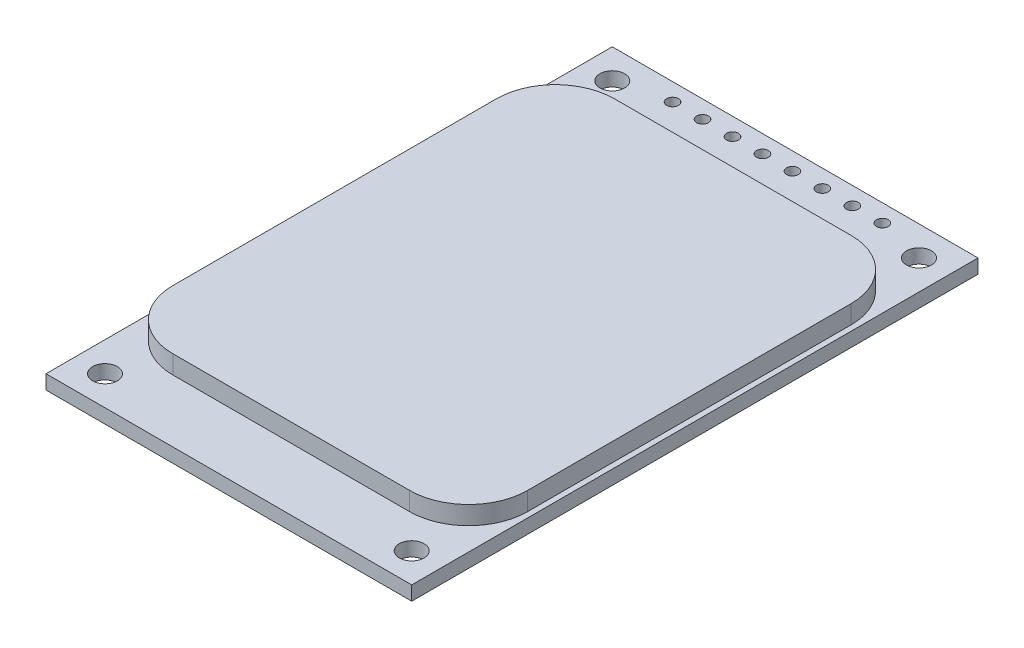
ISO-10303-21;
HEADER;
FILE_DESCRIPTION(('STEP AP214'),'2;1');
FILE_NAME('part.step','',(''),(''),'','','');
FILE_SCHEMA(('AUTOMOTIVE_DESIGN { 1 0 10303 214 1 1 1 1 }'));
ENDSEC;
DATA;
#1=APPLICATION_CONTEXT('core data for automotive mechanical design processes');
#2=APPLICATION_PROTOCOL_DEFINITION('international standard','automotive_design',2000,#1);
#3=PRODUCT_CONTEXT('',#1,'mechanical');
#4=PRODUCT('Part','Part','',(#3));
#5=PRODUCT_RELATED_PRODUCT_CATEGORY('part','',(#4));
#6=PRODUCT_DEFINITION_FORMATION('','',#4);
#7=PRODUCT_DEFINITION_CONTEXT('part definition',#1,'design');
#8=PRODUCT_DEFINITION('design','',#6,#7);
#9=PRODUCT_DEFINITION_SHAPE('','',#8);
#10=(LENGTH_UNIT() NAMED_UNIT(*) SI_UNIT(.MILLI.,.METRE.));
#11=(NAMED_UNIT(*) PLANE_ANGLE_UNIT() SI_UNIT($,.RADIAN.));
#12=(NAMED_UNIT(*) SI_UNIT($,.STERADIAN.) SOLID_ANGLE_UNIT());
#13=UNCERTAINTY_MEASURE_WITH_UNIT(LENGTH_MEASURE(1.E-05),#10,'distance_accuracy_value','');
#14=(GEOMETRIC_REPRESENTATION_CONTEXT(3) GLOBAL_UNCERTAINTY_ASSIGNED_CONTEXT((#13)) GLOBAL_UNIT_ASSIGNED_CONTEXT((#10,
#11,#12)) REPRESENTATION_CONTEXT('',''));
#15=CARTESIAN_POINT('',(0.,0.,0.));
#16=DIRECTION('',(0.,0.,1.));
#17=DIRECTION('',(1.,0.,0.));
#18=AXIS2_PLACEMENT_3D('',#15,#16,#17);
#19=CARTESIAN_POINT('',(0.,1.2,0.));
#20=DIRECTION('',(1.,0.,0.));
#21=DIRECTION('',(0.,0.,-1.));
#22=AXIS2_PLACEMENT_3D('',#19,#20,#21);
#23=PLANE('',#22);
#24=DIRECTION('',(0.,0.,1.));
#25=VECTOR('',#24,1.);
#26=CARTESIAN_POINT('',(0.,0.,0.));
#27=LINE('',#26,#25);
#28=CARTESIAN_POINT('',(0.,0.,0.));
#29=VERTEX_POINT('',#28);
#30=CARTESIAN_POINT('',(0.,0.,48.));
#31=VERTEX_POINT('',#30);
#32=EDGE_CURVE('E150',#29,#31,#27,.T.);
#33=ORIENTED_EDGE('',*,*,#32,.T.);
#34=DIRECTION('',(0.,-1.,0.));
#35=VECTOR('',#34,1.);
#36=CARTESIAN_POINT('',(0.,1.2,48.));
#37=LINE('',#36,#35);
#38=CARTESIAN_POINT('',(0.,1.2,48.));
#39=VERTEX_POINT('',#38);
#40=EDGE_CURVE('E131',#39,#31,#37,.T.);
#41=ORIENTED_EDGE('',*,*,#40,.F.);
#42=DIRECTION('',(0.,0.,1.));
#43=VECTOR('',#42,1.);
#44=CARTESIAN_POINT('',(0.,1.2,0.));
#45=LINE('',#44,#43);
#46=CARTESIAN_POINT('',(0.,1.2,0.));
#47=VERTEX_POINT('',#46);
#48=EDGE_CURVE('E138',#47,#39,#45,.T.);
#49=ORIENTED_EDGE('',*,*,#48,.F.);
#50=DIRECTION('',(0.,-1.,0.));
#51=VECTOR('',#50,1.);
#52=CARTESIAN_POINT('',(0.,1.2,0.));
#53=LINE('',#52,#51);
#54=EDGE_CURVE('E297',#47,#29,#53,.T.);
#55=ORIENTED_EDGE('',*,*,#54,.T.);
#56=EDGE_LOOP('',(#33,#41,#49,#55));
#57=FACE_BOUND('',#56,.T.);
#58=ADVANCED_FACE('F39',(#57),#23,.F.);
#59=CARTESIAN_POINT('',(0.,1.2,48.));
#60=DIRECTION('',(0.,0.,-1.));
#61=DIRECTION('',(-1.,0.,0.));
#62=AXIS2_PLACEMENT_3D('',#59,#60,#61);
#63=PLANE('',#62);
#64=DIRECTION('',(1.,0.,0.));
#65=VECTOR('',#64,1.);
#66=CARTESIAN_POINT('',(0.,0.,48.));
#67=LINE('',#66,#65);
#68=CARTESIAN_POINT('',(31.,0.,48.));
#69=VERTEX_POINT('',#68);
#70=EDGE_CURVE('E299',#31,#69,#67,.T.);
#71=ORIENTED_EDGE('',*,*,#70,.T.);
#72=DIRECTION('',(0.,-1.,0.));
#73=VECTOR('',#72,1.);
#74=CARTESIAN_POINT('',(31.,1.2,48.));
#75=LINE('',#74,#73);
#76=CARTESIAN_POINT('',(31.,1.2,48.));
#77=VERTEX_POINT('',#76);
#78=EDGE_CURVE('E134',#77,#69,#75,.T.);
#79=ORIENTED_EDGE('',*,*,#78,.F.);
#80=DIRECTION('',(1.,0.,0.));
#81=VECTOR('',#80,1.);
#82=CARTESIAN_POINT('',(0.,1.2,48.));
#83=LINE('',#82,#81);
#84=EDGE_CURVE('E127',#39,#77,#83,.T.);
#85=ORIENTED_EDGE('',*,*,#84,.F.);
#86=ORIENTED_EDGE('',*,*,#40,.T.);
#87=EDGE_LOOP('',(#71,#79,#85,#86));
#88=FACE_BOUND('',#87,.T.);
#89=ADVANCED_FACE('F129',(#88),#63,.F.);
#90=CARTESIAN_POINT('',(31.,1.2,0.));
#91=DIRECTION('',(-1.,0.,0.));
#92=DIRECTION('',(0.,0.,1.));
#93=AXIS2_PLACEMENT_3D('',#90,#91,#92);
#94=PLANE('',#93);
#95=DIRECTION('',(0.,0.,-1.));
#96=VECTOR('',#95,1.);
#97=CARTESIAN_POINT('',(31.,0.,0.));
#98=LINE('',#97,#96);
#99=CARTESIAN_POINT('',(31.,0.,0.));
#100=VERTEX_POINT('',#99);
#101=EDGE_CURVE('E301',#69,#100,#98,.T.);
#102=ORIENTED_EDGE('',*,*,#101,.T.);
#103=DIRECTION('',(0.,-1.,0.));
#104=VECTOR('',#103,1.);
#105=CARTESIAN_POINT('',(31.,1.2,0.));
#106=LINE('',#105,#104);
#107=CARTESIAN_POINT('',(31.,1.2,0.));
#108=VERTEX_POINT('',#107);
#109=EDGE_CURVE('E155',#108,#100,#106,.T.);
#110=ORIENTED_EDGE('',*,*,#109,.F.);
#111=DIRECTION('',(0.,0.,-1.));
#112=VECTOR('',#111,1.);
#113=CARTESIAN_POINT('',(31.,1.2,0.));
#114=LINE('',#113,#112);
#115=EDGE_CURVE('E137',#77,#108,#114,.T.);
#116=ORIENTED_EDGE('',*,*,#115,.F.);
#117=ORIENTED_EDGE('',*,*,#78,.T.);
#118=EDGE_LOOP('',(#102,#110,#116,#117));
#119=FACE_BOUND('',#118,.T.);
#120=ADVANCED_FACE('F313',(#119),#94,.F.);
#121=CARTESIAN_POINT('',(0.,1.2,0.));
#122=DIRECTION('',(0.,0.,1.));
#123=DIRECTION('',(1.,0.,0.));
#124=AXIS2_PLACEMENT_3D('',#121,#122,#123);
#125=PLANE('',#124);
#126=DIRECTION('',(-1.,0.,0.));
#127=VECTOR('',#126,1.);
#128=CARTESIAN_POINT('',(0.,0.,0.));
#129=LINE('',#128,#127);
#130=EDGE_CURVE('E147',#100,#29,#129,.T.);
#131=ORIENTED_EDGE('',*,*,#130,.T.);
#132=ORIENTED_EDGE('',*,*,#54,.F.);
#133=DIRECTION('',(-1.,0.,0.));
#134=VECTOR('',#133,1.);
#135=CARTESIAN_POINT('',(0.,1.2,0.));
#136=LINE('',#135,#134);
#137=EDGE_CURVE('E143',#108,#47,#136,.T.);
#138=ORIENTED_EDGE('',*,*,#137,.F.);
#139=ORIENTED_EDGE('',*,*,#109,.T.);
#140=EDGE_LOOP('',(#131,#132,#138,#139));
#141=FACE_BOUND('',#140,.T.);
#142=ADVANCED_FACE('F308',(#141),#125,.F.);
#143=CARTESIAN_POINT('',(0.,1.2,0.));
#144=DIRECTION('',(0.,1.,0.));
#145=DIRECTION('',(0.,0.,1.));
#146=AXIS2_PLACEMENT_3D('',#143,#144,#145);
#147=PLANE('',#146);
#148=DIRECTION('',(0.,0.,1.));
#149=VECTOR('',#148,1.);
#150=CARTESIAN_POINT('',(0.465000000000001,1.2,5.285));
#151=LINE('',#150,#149);
#152=CARTESIAN_POINT('',(0.465000000000001,1.2,10.285));
#153=VERTEX_POINT('',#152);
#154=CARTESIAN_POINT('',(0.465000000000003,1.2,37.715));
#155=VERTEX_POINT('',#154);
#156=EDGE_CURVE('E220',#153,#155,#151,.T.);
#157=ORIENTED_EDGE('',*,*,#156,.F.);
#158=CARTESIAN_POINT('',(5.465,1.2,10.285));
#159=DIRECTION('',(0.,1.,0.));
#160=DIRECTION('',(0.,0.,1.));
#161=AXIS2_PLACEMENT_3D('',#158,#159,#160);
#162=CIRCLE('',#161,5.);
#163=CARTESIAN_POINT('',(5.465,1.2,5.285));
#164=VERTEX_POINT('',#163);
#165=EDGE_CURVE('E11',#153,#164,#162,.F.);
#166=ORIENTED_EDGE('',*,*,#165,.T.);
#167=DIRECTION('',(-1.,0.,0.));
#168=VECTOR('',#167,1.);
#169=CARTESIAN_POINT('',(0.465000000000001,1.2,5.285));
#170=LINE('',#169,#168);
#171=CARTESIAN_POINT('',(25.535,1.2,5.285));
#172=VERTEX_POINT('',#171);
#173=EDGE_CURVE('E190',#172,#164,#170,.T.);
#174=ORIENTED_EDGE('',*,*,#173,.F.);
#175=CARTESIAN_POINT('',(25.535,1.2,10.285));
#176=DIRECTION('',(0.,1.,0.));
#177=DIRECTION('',(0.,0.,1.));
#178=AXIS2_PLACEMENT_3D('',#175,#176,#177);
#179=CIRCLE('',#178,5.);
#180=CARTESIAN_POINT('',(30.535,1.2,10.285));
#181=VERTEX_POINT('',#180);
#182=EDGE_CURVE('E47',#172,#181,#179,.F.);
#183=ORIENTED_EDGE('',*,*,#182,.T.);
#184=DIRECTION('',(0.,0.,-1.));
#185=VECTOR('',#184,1.);
#186=CARTESIAN_POINT('',(30.535,1.2,5.285));
#187=LINE('',#186,#185);
#188=CARTESIAN_POINT('',(30.535,1.2,37.715));
#189=VERTEX_POINT('',#188);
#190=EDGE_CURVE('E189',#189,#181,#187,.T.);
#191=ORIENTED_EDGE('',*,*,#190,.F.);
#192=CARTESIAN_POINT('',(25.535,1.2,37.715));
#193=DIRECTION('',(0.,1.,0.));
#194=DIRECTION('',(0.,0.,1.));
#195=AXIS2_PLACEMENT_3D('',#192,#193,#194);
#196=CIRCLE('',#195,5.);
#197=CARTESIAN_POINT('',(25.535,1.2,42.715));
#198=VERTEX_POINT('',#197);
#199=EDGE_CURVE('E185',#189,#198,#196,.F.);
#200=ORIENTED_EDGE('',*,*,#199,.T.);
#201=DIRECTION('',(1.,0.,0.));
#202=VECTOR('',#201,1.);
#203=CARTESIAN_POINT('',(0.465000000000003,1.2,42.715));
#204=LINE('',#203,#202);
#205=CARTESIAN_POINT('',(5.465,1.2,42.715));
#206=VERTEX_POINT('',#205);
#207=EDGE_CURVE('E196',#206,#198,#204,.T.);
#208=ORIENTED_EDGE('',*,*,#207,.F.);
#209=CARTESIAN_POINT('',(5.465,1.2,37.715));
#210=DIRECTION('',(0.,1.,0.));
#211=DIRECTION('',(0.,0.,1.));
#212=AXIS2_PLACEMENT_3D('',#209,#210,#211);
#213=CIRCLE('',#212,5.);
#214=EDGE_CURVE('E183',#206,#155,#213,.F.);
#215=ORIENTED_EDGE('',*,*,#214,.T.);
#216=EDGE_LOOP('',(#157,#166,#174,#183,#191,#200,#208,#215));
#217=FACE_BOUND('',#216,.T.);
#218=CARTESIAN_POINT('',(24.39,1.2,1.50000000000005));
#219=DIRECTION('',(0.,1.,0.));
#220=DIRECTION('',(0.,0.,-1.));
#221=AXIS2_PLACEMENT_3D('',#218,#219,#220);
#222=CIRCLE('',#221,0.500000000000002);
#223=CARTESIAN_POINT('',(24.39,1.2,1.00000000000005));
#224=VERTEX_POINT('',#223);
#225=EDGE_CURVE('E246',#224,#224,#222,.T.);
#226=ORIENTED_EDGE('',*,*,#225,.F.);
#227=EDGE_LOOP('',(#226));
#228=FACE_BOUND('',#227,.T.);
#229=CARTESIAN_POINT('',(6.61,1.2,1.50000000000006));
#230=DIRECTION('',(0.,1.,0.));
#231=DIRECTION('',(0.,0.,1.));
#232=AXIS2_PLACEMENT_3D('',#229,#230,#231);
#233=CIRCLE('',#232,0.500000000000001);
#234=CARTESIAN_POINT('',(6.61,1.2,2.00000000000006));
#235=VERTEX_POINT('',#234);
#236=EDGE_CURVE('E245',#235,#235,#233,.T.);
#237=ORIENTED_EDGE('',*,*,#236,.F.);
#238=EDGE_LOOP('',(#237));
#239=FACE_BOUND('',#238,.T.);
#240=CARTESIAN_POINT('',(9.15,1.2,1.50000000000004));
#241=DIRECTION('',(0.,1.,0.));
#242=DIRECTION('',(0.,0.,1.));
#243=AXIS2_PLACEMENT_3D('',#240,#241,#242);
#244=CIRCLE('',#243,0.500000000000002);
#245=CARTESIAN_POINT('',(9.15,1.2,2.00000000000004));
#246=VERTEX_POINT('',#245);
#247=EDGE_CURVE('E258',#246,#246,#244,.T.);
#248=ORIENTED_EDGE('',*,*,#247,.F.);
#249=EDGE_LOOP('',(#248));
#250=FACE_BOUND('',#249,.T.);
#251=CARTESIAN_POINT('',(11.69,1.2,1.50000000000002));
#252=DIRECTION('',(0.,1.,0.));
#253=DIRECTION('',(0.,0.,1.));
#254=AXIS2_PLACEMENT_3D('',#251,#252,#253);
#255=CIRCLE('',#254,0.500000000000001);
#256=CARTESIAN_POINT('',(11.69,1.2,2.00000000000002));
#257=VERTEX_POINT('',#256);
#258=EDGE_CURVE('E257',#257,#257,#255,.T.);
#259=ORIENTED_EDGE('',*,*,#258,.F.);
#260=EDGE_LOOP('',(#259));
#261=FACE_BOUND('',#260,.T.);
#262=CARTESIAN_POINT('',(21.85,1.2,1.50000000000004));
#263=DIRECTION('',(0.,1.,0.));
#264=DIRECTION('',(0.,0.,-1.));
#265=AXIS2_PLACEMENT_3D('',#262,#263,#264);
#266=CIRCLE('',#265,0.500000000000002);
#267=CARTESIAN_POINT('',(21.85,1.2,1.00000000000003));
#268=VERTEX_POINT('',#267);
#269=EDGE_CURVE('E230',#268,#268,#266,.T.);
#270=ORIENTED_EDGE('',*,*,#269,.F.);
#271=EDGE_LOOP('',(#270));
#272=FACE_BOUND('',#271,.T.);
#273=CARTESIAN_POINT('',(19.31,1.2,1.50000000000002));
#274=DIRECTION('',(0.,1.,0.));
#275=DIRECTION('',(0.,0.,-1.));
#276=AXIS2_PLACEMENT_3D('',#273,#274,#275);
#277=CIRCLE('',#276,0.499999999999999);
#278=CARTESIAN_POINT('',(19.31,1.2,1.00000000000002));
#279=VERTEX_POINT('',#278);
#280=EDGE_CURVE('E231',#279,#279,#277,.T.);
#281=ORIENTED_EDGE('',*,*,#280,.F.);
#282=EDGE_LOOP('',(#281));
#283=FACE_BOUND('',#282,.T.);
#284=CARTESIAN_POINT('',(16.77,1.2,1.49999999999992));
#285=DIRECTION('',(0.,1.,0.));
#286=DIRECTION('',(0.,0.,-1.));
#287=AXIS2_PLACEMENT_3D('',#284,#285,#286);
#288=CIRCLE('',#287,0.499999999999975);
#289=CARTESIAN_POINT('',(16.77,1.2,0.999999999999945));
#290=VERTEX_POINT('',#289);
#291=EDGE_CURVE('E214',#290,#290,#288,.T.);
#292=ORIENTED_EDGE('',*,*,#291,.F.);
#293=EDGE_LOOP('',(#292));
#294=FACE_BOUND('',#293,.T.);
#295=CARTESIAN_POINT('',(14.23,1.2,1.49999999999992));
#296=DIRECTION('',(0.,1.,0.));
#297=DIRECTION('',(0.,0.,1.));
#298=AXIS2_PLACEMENT_3D('',#295,#296,#297);
#299=CIRCLE('',#298,0.499999999999976);
#300=CARTESIAN_POINT('',(14.23,1.2,1.9999999999999));
#301=VERTEX_POINT('',#300);
#302=EDGE_CURVE('E261',#301,#301,#299,.T.);
#303=ORIENTED_EDGE('',*,*,#302,.F.);
#304=EDGE_LOOP('',(#303));
#305=FACE_BOUND('',#304,.T.);
#306=CARTESIAN_POINT('',(28.5,1.2,2.5));
#307=DIRECTION('',(0.,1.,0.));
#308=DIRECTION('',(0.,0.,1.));
#309=AXIS2_PLACEMENT_3D('',#306,#307,#308);
#310=CIRCLE('',#309,1.05);
#311=CARTESIAN_POINT('',(28.5,1.2,3.55));
#312=VERTEX_POINT('',#311);
#313=EDGE_CURVE('E281',#312,#312,#310,.T.);
#314=ORIENTED_EDGE('',*,*,#313,.F.);
#315=EDGE_LOOP('',(#314));
#316=FACE_BOUND('',#315,.T.);
#317=CARTESIAN_POINT('',(2.5,1.2,45.5));
#318=DIRECTION('',(0.,1.,0.));
#319=DIRECTION('',(0.,0.,1.));
#320=AXIS2_PLACEMENT_3D('',#317,#318,#319);
#321=CIRCLE('',#320,1.05);
#322=CARTESIAN_POINT('',(2.5,1.2,46.55));
#323=VERTEX_POINT('',#322);
#324=EDGE_CURVE('E282',#323,#323,#321,.T.);
#325=ORIENTED_EDGE('',*,*,#324,.F.);
#326=EDGE_LOOP('',(#325));
#327=FACE_BOUND('',#326,.T.);
#328=CARTESIAN_POINT('',(28.5,1.2,45.5));
#329=DIRECTION('',(0.,1.,0.));
#330=DIRECTION('',(0.,0.,1.));
#331=AXIS2_PLACEMENT_3D('',#328,#329,#330);
#332=CIRCLE('',#331,1.05);
#333=CARTESIAN_POINT('',(28.5,1.2,46.55));
#334=VERTEX_POINT('',#333);
#335=EDGE_CURVE('E274',#334,#334,#332,.T.);
#336=ORIENTED_EDGE('',*,*,#335,.F.);
#337=EDGE_LOOP('',(#336));
#338=FACE_BOUND('',#337,.T.);
#339=CARTESIAN_POINT('',(2.5,1.2,2.5));
#340=DIRECTION('',(0.,1.,0.));
#341=DIRECTION('',(0.,0.,1.));
#342=AXIS2_PLACEMENT_3D('',#339,#340,#341);
#343=CIRCLE('',#342,1.05);
#344=CARTESIAN_POINT('',(2.5,1.2,3.55));
#345=VERTEX_POINT('',#344);
#346=EDGE_CURVE('E285',#345,#345,#343,.T.);
#347=ORIENTED_EDGE('',*,*,#346,.F.);
#348=EDGE_LOOP('',(#347));
#349=FACE_BOUND('',#348,.T.);
#350=ORIENTED_EDGE('',*,*,#48,.T.);
#351=ORIENTED_EDGE('',*,*,#84,.T.);
#352=ORIENTED_EDGE('',*,*,#115,.T.);
#353=ORIENTED_EDGE('',*,*,#137,.T.);
#354=EDGE_LOOP('',(#350,#351,#352,#353));
#355=FACE_BOUND('',#354,.T.);
#356=ADVANCED_FACE('F141',(#217,#228,#239,#250,#261,#272,#283,#294,#305,#316,#327,#338,#349,
#355),#147,.T.);
#357=CARTESIAN_POINT('',(0.,0.,0.));
#358=DIRECTION('',(0.,1.,0.));
#359=DIRECTION('',(0.,0.,1.));
#360=AXIS2_PLACEMENT_3D('',#357,#358,#359);
#361=PLANE('',#360);
#362=CARTESIAN_POINT('',(24.39,0.,1.50000000000005));
#363=DIRECTION('',(0.,1.,0.));
#364=DIRECTION('',(0.,0.,1.));
#365=AXIS2_PLACEMENT_3D('',#362,#363,#364);
#366=CIRCLE('',#365,0.500000000000002);
#367=CARTESIAN_POINT('',(24.39,0.,2.00000000000006));
#368=VERTEX_POINT('',#367);
#369=EDGE_CURVE('E234',#368,#368,#366,.F.);
#370=ORIENTED_EDGE('',*,*,#369,.F.);
#371=EDGE_LOOP('',(#370));
#372=FACE_BOUND('',#371,.T.);
#373=CARTESIAN_POINT('',(6.61,0.,1.50000000000006));
#374=DIRECTION('',(0.,1.,0.));
#375=DIRECTION('',(0.,0.,1.));
#376=AXIS2_PLACEMENT_3D('',#373,#374,#375);
#377=CIRCLE('',#376,0.500000000000001);
#378=CARTESIAN_POINT('',(6.61,0.,2.00000000000006));
#379=VERTEX_POINT('',#378);
#380=EDGE_CURVE('E242',#379,#379,#377,.F.);
#381=ORIENTED_EDGE('',*,*,#380,.F.);
#382=EDGE_LOOP('',(#381));
#383=FACE_BOUND('',#382,.T.);
#384=CARTESIAN_POINT('',(9.15,0.,1.50000000000004));
#385=DIRECTION('',(0.,1.,0.));
#386=DIRECTION('',(0.,0.,1.));
#387=AXIS2_PLACEMENT_3D('',#384,#385,#386);
#388=CIRCLE('',#387,0.500000000000002);
#389=CARTESIAN_POINT('',(9.15,0.,2.00000000000004));
#390=VERTEX_POINT('',#389);
#391=EDGE_CURVE('E249',#390,#390,#388,.F.);
#392=ORIENTED_EDGE('',*,*,#391,.F.);
#393=EDGE_LOOP('',(#392));
#394=FACE_BOUND('',#393,.T.);
#395=CARTESIAN_POINT('',(11.69,0.,1.50000000000002));
#396=DIRECTION('',(0.,1.,0.));
#397=DIRECTION('',(0.,0.,1.));
#398=AXIS2_PLACEMENT_3D('',#395,#396,#397);
#399=CIRCLE('',#398,0.500000000000001);
#400=CARTESIAN_POINT('',(11.69,0.,2.00000000000002));
#401=VERTEX_POINT('',#400);
#402=EDGE_CURVE('E254',#401,#401,#399,.F.);
#403=ORIENTED_EDGE('',*,*,#402,.F.);
#404=EDGE_LOOP('',(#403));
#405=FACE_BOUND('',#404,.T.);
#406=CARTESIAN_POINT('',(21.85,0.,1.50000000000004));
#407=DIRECTION('',(0.,1.,0.));
#408=DIRECTION('',(0.,0.,1.));
#409=AXIS2_PLACEMENT_3D('',#406,#407,#408);
#410=CIRCLE('',#409,0.500000000000002);
#411=CARTESIAN_POINT('',(21.85,0.,2.00000000000004));
#412=VERTEX_POINT('',#411);
#413=EDGE_CURVE('E227',#412,#412,#410,.F.);
#414=ORIENTED_EDGE('',*,*,#413,.F.);
#415=EDGE_LOOP('',(#414));
#416=FACE_BOUND('',#415,.T.);
#417=CARTESIAN_POINT('',(19.31,0.,1.50000000000002));
#418=DIRECTION('',(0.,1.,0.));
#419=DIRECTION('',(0.,0.,1.));
#420=AXIS2_PLACEMENT_3D('',#417,#418,#419);
#421=CIRCLE('',#420,0.499999999999999);
#422=CARTESIAN_POINT('',(19.31,0.,2.00000000000002));
#423=VERTEX_POINT('',#422);
#424=EDGE_CURVE('E235',#423,#423,#421,.F.);
#425=ORIENTED_EDGE('',*,*,#424,.F.);
#426=EDGE_LOOP('',(#425));
#427=FACE_BOUND('',#426,.T.);
#428=CARTESIAN_POINT('',(16.77,0.,1.49999999999992));
#429=DIRECTION('',(0.,1.,0.));
#430=DIRECTION('',(0.,0.,1.));
#431=AXIS2_PLACEMENT_3D('',#428,#429,#430);
#432=CIRCLE('',#431,0.499999999999975);
#433=CARTESIAN_POINT('',(16.77,0.,1.99999999999989));
#434=VERTEX_POINT('',#433);
#435=EDGE_CURVE('E211',#434,#434,#432,.F.);
#436=ORIENTED_EDGE('',*,*,#435,.F.);
#437=EDGE_LOOP('',(#436));
#438=FACE_BOUND('',#437,.T.);
#439=CARTESIAN_POINT('',(14.23,0.,1.49999999999992));
#440=DIRECTION('',(0.,1.,0.));
#441=DIRECTION('',(0.,0.,1.));
#442=AXIS2_PLACEMENT_3D('',#439,#440,#441);
#443=CIRCLE('',#442,0.499999999999976);
#444=CARTESIAN_POINT('',(14.23,0.,1.9999999999999));
#445=VERTEX_POINT('',#444);
#446=EDGE_CURVE('E268',#445,#445,#443,.F.);
#447=ORIENTED_EDGE('',*,*,#446,.F.);
#448=EDGE_LOOP('',(#447));
#449=FACE_BOUND('',#448,.T.);
#450=CARTESIAN_POINT('',(28.5,0.,2.5));
#451=DIRECTION('',(0.,1.,0.));
#452=DIRECTION('',(0.,0.,1.));
#453=AXIS2_PLACEMENT_3D('',#450,#451,#452);
#454=CIRCLE('',#453,1.05);
#455=CARTESIAN_POINT('',(28.5,0.,3.55));
#456=VERTEX_POINT('',#455);
#457=EDGE_CURVE('E278',#456,#456,#454,.F.);
#458=ORIENTED_EDGE('',*,*,#457,.F.);
#459=EDGE_LOOP('',(#458));
#460=FACE_BOUND('',#459,.T.);
#461=CARTESIAN_POINT('',(2.5,0.,45.5));
#462=DIRECTION('',(0.,1.,0.));
#463=DIRECTION('',(0.,0.,1.));
#464=AXIS2_PLACEMENT_3D('',#461,#462,#463);
#465=CIRCLE('',#464,1.05);
#466=CARTESIAN_POINT('',(2.5,0.,46.55));
#467=VERTEX_POINT('',#466);
#468=EDGE_CURVE('E277',#467,#467,#465,.F.);
#469=ORIENTED_EDGE('',*,*,#468,.F.);
#470=EDGE_LOOP('',(#469));
#471=FACE_BOUND('',#470,.T.);
#472=CARTESIAN_POINT('',(28.5,0.,45.5));
#473=DIRECTION('',(0.,1.,0.));
#474=DIRECTION('',(0.,0.,1.));
#475=AXIS2_PLACEMENT_3D('',#472,#473,#474);
#476=CIRCLE('',#475,1.05);
#477=CARTESIAN_POINT('',(28.5,0.,46.55));
#478=VERTEX_POINT('',#477);
#479=EDGE_CURVE('E271',#478,#478,#476,.F.);
#480=ORIENTED_EDGE('',*,*,#479,.F.);
#481=EDGE_LOOP('',(#480));
#482=FACE_BOUND('',#481,.T.);
#483=CARTESIAN_POINT('',(2.5,0.,2.5));
#484=DIRECTION('',(0.,1.,0.));
#485=DIRECTION('',(0.,0.,1.));
#486=AXIS2_PLACEMENT_3D('',#483,#484,#485);
#487=CIRCLE('',#486,1.05);
#488=CARTESIAN_POINT('',(2.5,0.,3.55));
#489=VERTEX_POINT('',#488);
#490=EDGE_CURVE('E292',#489,#489,#487,.F.);
#491=ORIENTED_EDGE('',*,*,#490,.F.);
#492=EDGE_LOOP('',(#491));
#493=FACE_BOUND('',#492,.T.);
#494=ORIENTED_EDGE('',*,*,#32,.F.);
#495=ORIENTED_EDGE('',*,*,#130,.F.);
#496=ORIENTED_EDGE('',*,*,#101,.F.);
#497=ORIENTED_EDGE('',*,*,#70,.F.);
#498=EDGE_LOOP('',(#494,#495,#496,#497));
#499=FACE_BOUND('',#498,.T.);
#500=ADVANCED_FACE('F312',(#372,#383,#394,#405,#416,#427,#438,#449,#460,#471,#482,#493,#499),
#361,.F.);
#501=CARTESIAN_POINT('',(2.5,-0.000999999999999916,2.5));
#502=DIRECTION('',(0.,1.,0.));
#503=DIRECTION('',(0.,0.,1.));
#504=AXIS2_PLACEMENT_3D('',#501,#502,#503);
#505=CYLINDRICAL_SURFACE('',#504,1.05);
#506=ORIENTED_EDGE('',*,*,#346,.T.);
#507=EDGE_LOOP('',(#506));
#508=FACE_BOUND('',#507,.T.);
#509=ORIENTED_EDGE('',*,*,#490,.T.);
#510=EDGE_LOOP('',(#509));
#511=FACE_BOUND('',#510,.T.);
#512=ADVANCED_FACE('F403',(#508,#511),#505,.F.);
#513=CARTESIAN_POINT('',(28.5,-0.000999999999999916,45.5));
#514=DIRECTION('',(0.,1.,0.));
#515=DIRECTION('',(0.,0.,1.));
#516=AXIS2_PLACEMENT_3D('',#513,#514,#515);
#517=CYLINDRICAL_SURFACE('',#516,1.05);
#518=ORIENTED_EDGE('',*,*,#335,.T.);
#519=EDGE_LOOP('',(#518));
#520=FACE_BOUND('',#519,.T.);
#521=ORIENTED_EDGE('',*,*,#479,.T.);
#522=EDGE_LOOP('',(#521));
#523=FACE_BOUND('',#522,.T.);
#524=ADVANCED_FACE('F399',(#520,#523),#517,.F.);
#525=CARTESIAN_POINT('',(2.5,-0.000999999999999916,45.5));
#526=DIRECTION('',(0.,1.,0.));
#527=DIRECTION('',(0.,0.,1.));
#528=AXIS2_PLACEMENT_3D('',#525,#526,#527);
#529=CYLINDRICAL_SURFACE('',#528,1.05);
#530=ORIENTED_EDGE('',*,*,#324,.T.);
#531=EDGE_LOOP('',(#530));
#532=FACE_BOUND('',#531,.T.);
#533=ORIENTED_EDGE('',*,*,#468,.T.);
#534=EDGE_LOOP('',(#533));
#535=FACE_BOUND('',#534,.T.);
#536=ADVANCED_FACE('F402',(#532,#535),#529,.F.);
#537=CARTESIAN_POINT('',(28.5,-0.000999999999999916,2.5));
#538=DIRECTION('',(0.,1.,0.));
#539=DIRECTION('',(0.,0.,1.));
#540=AXIS2_PLACEMENT_3D('',#537,#538,#539);
#541=CYLINDRICAL_SURFACE('',#540,1.05);
#542=ORIENTED_EDGE('',*,*,#313,.T.);
#543=EDGE_LOOP('',(#542));
#544=FACE_BOUND('',#543,.T.);
#545=ORIENTED_EDGE('',*,*,#457,.T.);
#546=EDGE_LOOP('',(#545));
#547=FACE_BOUND('',#546,.T.);
#548=ADVANCED_FACE('F397',(#544,#547),#541,.F.);
#549=CARTESIAN_POINT('',(14.23,-0.000999999999999916,1.49999999999992));
#550=DIRECTION('',(0.,1.,0.));
#551=DIRECTION('',(0.,0.,1.));
#552=AXIS2_PLACEMENT_3D('',#549,#550,#551);
#553=CYLINDRICAL_SURFACE('',#552,0.499999999999976);
#554=ORIENTED_EDGE('',*,*,#302,.T.);
#555=EDGE_LOOP('',(#554));
#556=FACE_BOUND('',#555,.T.);
#557=ORIENTED_EDGE('',*,*,#446,.T.);
#558=EDGE_LOOP('',(#557));
#559=FACE_BOUND('',#558,.T.);
#560=ADVANCED_FACE('F379',(#556,#559),#553,.F.);
#561=CARTESIAN_POINT('',(16.77,-0.000999999999999916,1.49999999999992));
#562=DIRECTION('',(0.,1.,0.));
#563=DIRECTION('',(0.,0.,1.));
#564=AXIS2_PLACEMENT_3D('',#561,#562,#563);
#565=CYLINDRICAL_SURFACE('',#564,0.499999999999975);
#566=ORIENTED_EDGE('',*,*,#291,.T.);
#567=EDGE_LOOP('',(#566));
#568=FACE_BOUND('',#567,.T.);
#569=ORIENTED_EDGE('',*,*,#435,.T.);
#570=EDGE_LOOP('',(#569));
#571=FACE_BOUND('',#570,.T.);
#572=ADVANCED_FACE('F375',(#568,#571),#565,.F.);
#573=CARTESIAN_POINT('',(19.31,-0.000999999999999916,1.50000000000002));
#574=DIRECTION('',(0.,1.,0.));
#575=DIRECTION('',(0.,0.,1.));
#576=AXIS2_PLACEMENT_3D('',#573,#574,#575);
#577=CYLINDRICAL_SURFACE('',#576,0.499999999999999);
#578=ORIENTED_EDGE('',*,*,#280,.T.);
#579=EDGE_LOOP('',(#578));
#580=FACE_BOUND('',#579,.T.);
#581=ORIENTED_EDGE('',*,*,#424,.T.);
#582=EDGE_LOOP('',(#581));
#583=FACE_BOUND('',#582,.T.);
#584=ADVANCED_FACE('F371',(#580,#583),#577,.F.);
#585=CARTESIAN_POINT('',(21.85,-0.000999999999999916,1.50000000000004));
#586=DIRECTION('',(0.,1.,0.));
#587=DIRECTION('',(0.,0.,1.));
#588=AXIS2_PLACEMENT_3D('',#585,#586,#587);
#589=CYLINDRICAL_SURFACE('',#588,0.500000000000002);
#590=ORIENTED_EDGE('',*,*,#269,.T.);
#591=EDGE_LOOP('',(#590));
#592=FACE_BOUND('',#591,.T.);
#593=ORIENTED_EDGE('',*,*,#413,.T.);
#594=EDGE_LOOP('',(#593));
#595=FACE_BOUND('',#594,.T.);
#596=ADVANCED_FACE('F367',(#592,#595),#589,.F.);
#597=CARTESIAN_POINT('',(11.69,-0.000999999999999916,1.50000000000002));
#598=DIRECTION('',(0.,1.,0.));
#599=DIRECTION('',(0.,0.,1.));
#600=AXIS2_PLACEMENT_3D('',#597,#598,#599);
#601=CYLINDRICAL_SURFACE('',#600,0.500000000000001);
#602=ORIENTED_EDGE('',*,*,#258,.T.);
#603=EDGE_LOOP('',(#602));
#604=FACE_BOUND('',#603,.T.);
#605=ORIENTED_EDGE('',*,*,#402,.T.);
#606=EDGE_LOOP('',(#605));
#607=FACE_BOUND('',#606,.T.);
#608=ADVANCED_FACE('F370',(#604,#607),#601,.F.);
#609=CARTESIAN_POINT('',(9.15,-0.000999999999999916,1.50000000000004));
#610=DIRECTION('',(0.,1.,0.));
#611=DIRECTION('',(0.,0.,1.));
#612=AXIS2_PLACEMENT_3D('',#609,#610,#611);
#613=CYLINDRICAL_SURFACE('',#612,0.500000000000002);
#614=ORIENTED_EDGE('',*,*,#247,.T.);
#615=EDGE_LOOP('',(#614));
#616=FACE_BOUND('',#615,.T.);
#617=ORIENTED_EDGE('',*,*,#391,.T.);
#618=EDGE_LOOP('',(#617));
#619=FACE_BOUND('',#618,.T.);
#620=ADVANCED_FACE('F384',(#616,#619),#613,.F.);
#621=CARTESIAN_POINT('',(6.61,-0.000999999999999916,1.50000000000006));
#622=DIRECTION('',(0.,1.,0.));
#623=DIRECTION('',(0.,0.,1.));
#624=AXIS2_PLACEMENT_3D('',#621,#622,#623);
#625=CYLINDRICAL_SURFACE('',#624,0.500000000000001);
#626=ORIENTED_EDGE('',*,*,#236,.T.);
#627=EDGE_LOOP('',(#626));
#628=FACE_BOUND('',#627,.T.);
#629=ORIENTED_EDGE('',*,*,#380,.T.);
#630=EDGE_LOOP('',(#629));
#631=FACE_BOUND('',#630,.T.);
#632=ADVANCED_FACE('F381',(#628,#631),#625,.F.);
#633=CARTESIAN_POINT('',(24.39,-0.000999999999999916,1.50000000000005));
#634=DIRECTION('',(0.,1.,0.));
#635=DIRECTION('',(0.,0.,1.));
#636=AXIS2_PLACEMENT_3D('',#633,#634,#635);
#637=CYLINDRICAL_SURFACE('',#636,0.500000000000002);
#638=ORIENTED_EDGE('',*,*,#225,.T.);
#639=EDGE_LOOP('',(#638));
#640=FACE_BOUND('',#639,.T.);
#641=ORIENTED_EDGE('',*,*,#369,.T.);
#642=EDGE_LOOP('',(#641));
#643=FACE_BOUND('',#642,.T.);
#644=ADVANCED_FACE('F363',(#640,#643),#637,.F.);
#645=CARTESIAN_POINT('',(0.465000000000001,2.76,5.285));
#646=DIRECTION('',(1.,0.,0.));
#647=DIRECTION('',(0.,0.,-1.));
#648=AXIS2_PLACEMENT_3D('',#645,#646,#647);
#649=PLANE('',#648);
#650=ORIENTED_EDGE('',*,*,#156,.T.);
#651=DIRECTION('',(0.,-1.,0.));
#652=VECTOR('',#651,1.);
#653=CARTESIAN_POINT('',(0.465000000000003,2.76,37.715));
#654=LINE('',#653,#652);
#655=CARTESIAN_POINT('',(0.465000000000003,2.76,37.715));
#656=VERTEX_POINT('',#655);
#657=EDGE_CURVE('E164',#155,#656,#654,.F.);
#658=ORIENTED_EDGE('',*,*,#657,.T.);
#659=DIRECTION('',(0.,0.,1.));
#660=VECTOR('',#659,1.);
#661=CARTESIAN_POINT('',(0.465000000000001,2.76,5.285));
#662=LINE('',#661,#660);
#663=CARTESIAN_POINT('',(0.465000000000001,2.76,10.285));
#664=VERTEX_POINT('',#663);
#665=EDGE_CURVE('E226',#664,#656,#662,.T.);
#666=ORIENTED_EDGE('',*,*,#665,.F.);
#667=DIRECTION('',(0.,-1.,0.));
#668=VECTOR('',#667,1.);
#669=CARTESIAN_POINT('',(0.465000000000001,2.76,10.285));
#670=LINE('',#669,#668);
#671=EDGE_CURVE('E161',#664,#153,#670,.T.);
#672=ORIENTED_EDGE('',*,*,#671,.T.);
#673=EDGE_LOOP('',(#650,#658,#666,#672));
#674=FACE_BOUND('',#673,.T.);
#675=ADVANCED_FACE('F345',(#674),#649,.F.);
#676=CARTESIAN_POINT('',(0.465000000000003,2.76,42.715));
#677=DIRECTION('',(0.,0.,-1.));
#678=DIRECTION('',(-1.,0.,0.));
#679=AXIS2_PLACEMENT_3D('',#676,#677,#678);
#680=PLANE('',#679);
#681=DIRECTION('',(1.,0.,0.));
#682=VECTOR('',#681,1.);
#683=CARTESIAN_POINT('',(0.465000000000003,2.76,42.715));
#684=LINE('',#683,#682);
#685=CARTESIAN_POINT('',(5.465,2.76,42.715));
#686=VERTEX_POINT('',#685);
#687=CARTESIAN_POINT('',(25.535,2.76,42.715));
#688=VERTEX_POINT('',#687);
#689=EDGE_CURVE('E216',#686,#688,#684,.T.);
#690=ORIENTED_EDGE('',*,*,#689,.F.);
#691=DIRECTION('',(0.,-1.,0.));
#692=VECTOR('',#691,1.);
#693=CARTESIAN_POINT('',(5.465,2.76,42.715));
#694=LINE('',#693,#692);
#695=EDGE_CURVE('E153',#686,#206,#694,.T.);
#696=ORIENTED_EDGE('',*,*,#695,.T.);
#697=ORIENTED_EDGE('',*,*,#207,.T.);
#698=DIRECTION('',(0.,-1.,0.));
#699=VECTOR('',#698,1.);
#700=CARTESIAN_POINT('',(25.535,2.76,42.715));
#701=LINE('',#700,#699);
#702=EDGE_CURVE('E151',#198,#688,#701,.F.);
#703=ORIENTED_EDGE('',*,*,#702,.T.);
#704=EDGE_LOOP('',(#690,#696,#697,#703));
#705=FACE_BOUND('',#704,.T.);
#706=ADVANCED_FACE('F355',(#705),#680,.F.);
#707=CARTESIAN_POINT('',(30.535,2.76,5.285));
#708=DIRECTION('',(-1.,0.,0.));
#709=DIRECTION('',(0.,0.,1.));
#710=AXIS2_PLACEMENT_3D('',#707,#708,#709);
#711=PLANE('',#710);
#712=DIRECTION('',(0.,0.,-1.));
#713=VECTOR('',#712,1.);
#714=CARTESIAN_POINT('',(30.535,2.76,5.285));
#715=LINE('',#714,#713);
#716=CARTESIAN_POINT('',(30.535,2.76,37.715));
#717=VERTEX_POINT('',#716);
#718=CARTESIAN_POINT('',(30.535,2.76,10.285));
#719=VERTEX_POINT('',#718);
#720=EDGE_CURVE('E207',#717,#719,#715,.T.);
#721=ORIENTED_EDGE('',*,*,#720,.F.);
#722=DIRECTION('',(0.,-1.,0.));
#723=VECTOR('',#722,1.);
#724=CARTESIAN_POINT('',(30.535,2.76,37.715));
#725=LINE('',#724,#723);
#726=EDGE_CURVE('E176',#717,#189,#725,.T.);
#727=ORIENTED_EDGE('',*,*,#726,.T.);
#728=ORIENTED_EDGE('',*,*,#190,.T.);
#729=DIRECTION('',(0.,-1.,0.));
#730=VECTOR('',#729,1.);
#731=CARTESIAN_POINT('',(30.535,2.76,10.285));
#732=LINE('',#731,#730);
#733=EDGE_CURVE('E174',#181,#719,#732,.F.);
#734=ORIENTED_EDGE('',*,*,#733,.T.);
#735=EDGE_LOOP('',(#721,#727,#728,#734));
#736=FACE_BOUND('',#735,.T.);
#737=ADVANCED_FACE('F193',(#736),#711,.F.);
#738=CARTESIAN_POINT('',(0.465000000000001,2.76,5.285));
#739=DIRECTION('',(0.,0.,1.));
#740=DIRECTION('',(1.,0.,0.));
#741=AXIS2_PLACEMENT_3D('',#738,#739,#740);
#742=PLANE('',#741);
#743=DIRECTION('',(-1.,0.,0.));
#744=VECTOR('',#743,1.);
#745=CARTESIAN_POINT('',(0.465000000000001,2.76,5.285));
#746=LINE('',#745,#744);
#747=CARTESIAN_POINT('',(25.535,2.76,5.285));
#748=VERTEX_POINT('',#747);
#749=CARTESIAN_POINT('',(5.465,2.76,5.285));
#750=VERTEX_POINT('',#749);
#751=EDGE_CURVE('E205',#748,#750,#746,.T.);
#752=ORIENTED_EDGE('',*,*,#751,.F.);
#753=DIRECTION('',(0.,-1.,0.));
#754=VECTOR('',#753,1.);
#755=CARTESIAN_POINT('',(25.535,2.76,5.285));
#756=LINE('',#755,#754);
#757=EDGE_CURVE('E181',#748,#172,#756,.T.);
#758=ORIENTED_EDGE('',*,*,#757,.T.);
#759=ORIENTED_EDGE('',*,*,#173,.T.);
#760=DIRECTION('',(0.,-1.,0.));
#761=VECTOR('',#760,1.);
#762=CARTESIAN_POINT('',(5.465,2.76,5.285));
#763=LINE('',#762,#761);
#764=EDGE_CURVE('E179',#164,#750,#763,.F.);
#765=ORIENTED_EDGE('',*,*,#764,.T.);
#766=EDGE_LOOP('',(#752,#758,#759,#765));
#767=FACE_BOUND('',#766,.T.);
#768=ADVANCED_FACE('F209',(#767),#742,.F.);
#769=CARTESIAN_POINT('',(0.,2.76,0.));
#770=DIRECTION('',(0.,1.,0.));
#771=DIRECTION('',(0.,0.,1.));
#772=AXIS2_PLACEMENT_3D('',#769,#770,#771);
#773=PLANE('',#772);
#774=ORIENTED_EDGE('',*,*,#665,.T.);
#775=CARTESIAN_POINT('',(5.465,2.76,37.715));
#776=DIRECTION('',(0.,1.,0.));
#777=DIRECTION('',(0.,0.,1.));
#778=AXIS2_PLACEMENT_3D('',#775,#776,#777);
#779=CIRCLE('',#778,5.);
#780=EDGE_CURVE('E172',#656,#686,#779,.T.);
#781=ORIENTED_EDGE('',*,*,#780,.T.);
#782=ORIENTED_EDGE('',*,*,#689,.T.);
#783=CARTESIAN_POINT('',(25.535,2.76,37.715));
#784=DIRECTION('',(0.,1.,0.));
#785=DIRECTION('',(0.,0.,1.));
#786=AXIS2_PLACEMENT_3D('',#783,#784,#785);
#787=CIRCLE('',#786,5.);
#788=EDGE_CURVE('E170',#688,#717,#787,.T.);
#789=ORIENTED_EDGE('',*,*,#788,.T.);
#790=ORIENTED_EDGE('',*,*,#720,.T.);
#791=CARTESIAN_POINT('',(25.535,2.76,10.285));
#792=DIRECTION('',(0.,1.,0.));
#793=DIRECTION('',(0.,0.,1.));
#794=AXIS2_PLACEMENT_3D('',#791,#792,#793);
#795=CIRCLE('',#794,5.);
#796=EDGE_CURVE('E168',#719,#748,#795,.T.);
#797=ORIENTED_EDGE('',*,*,#796,.T.);
#798=ORIENTED_EDGE('',*,*,#751,.T.);
#799=CARTESIAN_POINT('',(5.465,2.76,10.285));
#800=DIRECTION('',(0.,1.,0.));
#801=DIRECTION('',(0.,0.,1.));
#802=AXIS2_PLACEMENT_3D('',#799,#800,#801);
#803=CIRCLE('',#802,5.);
#804=EDGE_CURVE('E166',#750,#664,#803,.T.);
#805=ORIENTED_EDGE('',*,*,#804,.T.);
#806=EDGE_LOOP('',(#774,#781,#782,#789,#790,#797,#798,#805));
#807=FACE_BOUND('',#806,.T.);
#808=ADVANCED_FACE('F204',(#807),#773,.T.);
#809=CARTESIAN_POINT('',(5.465,2.76,37.715));
#810=DIRECTION('',(0.,-1.,0.));
#811=DIRECTION('',(0.,0.,-1.));
#812=AXIS2_PLACEMENT_3D('',#809,#810,#811);
#813=CYLINDRICAL_SURFACE('',#812,5.);
#814=ORIENTED_EDGE('',*,*,#780,.F.);
#815=ORIENTED_EDGE('',*,*,#657,.F.);
#816=ORIENTED_EDGE('',*,*,#214,.F.);
#817=ORIENTED_EDGE('',*,*,#695,.F.);
#818=EDGE_LOOP('',(#814,#815,#816,#817));
#819=FACE_BOUND('',#818,.T.);
#820=ADVANCED_FACE('F327',(#819),#813,.T.);
#821=CARTESIAN_POINT('',(25.535,2.76,37.715));
#822=DIRECTION('',(0.,-1.,0.));
#823=DIRECTION('',(0.,0.,-1.));
#824=AXIS2_PLACEMENT_3D('',#821,#822,#823);
#825=CYLINDRICAL_SURFACE('',#824,5.);
#826=ORIENTED_EDGE('',*,*,#788,.F.);
#827=ORIENTED_EDGE('',*,*,#702,.F.);
#828=ORIENTED_EDGE('',*,*,#199,.F.);
#829=ORIENTED_EDGE('',*,*,#726,.F.);
#830=EDGE_LOOP('',(#826,#827,#828,#829));
#831=FACE_BOUND('',#830,.T.);
#832=ADVANCED_FACE('F330',(#831),#825,.T.);
#833=CARTESIAN_POINT('',(25.535,2.76,10.285));
#834=DIRECTION('',(0.,-1.,0.));
#835=DIRECTION('',(0.,0.,-1.));
#836=AXIS2_PLACEMENT_3D('',#833,#834,#835);
#837=CYLINDRICAL_SURFACE('',#836,5.);
#838=ORIENTED_EDGE('',*,*,#796,.F.);
#839=ORIENTED_EDGE('',*,*,#733,.F.);
#840=ORIENTED_EDGE('',*,*,#182,.F.);
#841=ORIENTED_EDGE('',*,*,#757,.F.);
#842=EDGE_LOOP('',(#838,#839,#840,#841));
#843=FACE_BOUND('',#842,.T.);
#844=ADVANCED_FACE('F199',(#843),#837,.T.);
#845=CARTESIAN_POINT('',(5.465,2.76,10.285));
#846=DIRECTION('',(0.,-1.,0.));
#847=DIRECTION('',(0.,0.,-1.));
#848=AXIS2_PLACEMENT_3D('',#845,#846,#847);
#849=CYLINDRICAL_SURFACE('',#848,5.);
#850=ORIENTED_EDGE('',*,*,#804,.F.);
#851=ORIENTED_EDGE('',*,*,#764,.F.);
#852=ORIENTED_EDGE('',*,*,#165,.F.);
#853=ORIENTED_EDGE('',*,*,#671,.F.);
#854=EDGE_LOOP('',(#850,#851,#852,#853));
#855=FACE_BOUND('',#854,.T.);
#856=ADVANCED_FACE('F41',(#855),#849,.T.);
#857=CLOSED_SHELL('',(#58,#89,#120,#142,#356,#500,#512,#524,#536,#548,#560,#572,#584,#596,#608,
#620,#632,#644,#675,#706,#737,#768,#808,#820,#832,#844,#856));
#858=MANIFOLD_SOLID_BREP('B2',#857);
#859=ADVANCED_BREP_SHAPE_REPRESENTATION('',(#18,#858),#14);
#860=SHAPE_DEFINITION_REPRESENTATION(#9,#859);
ENDSEC;
END-ISO-10303-21;
